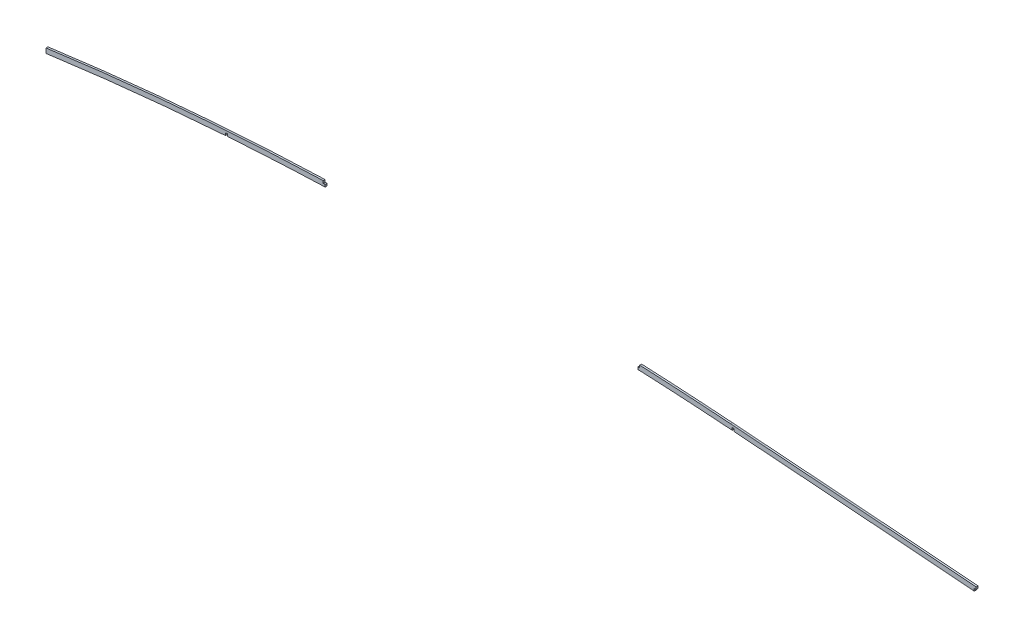
ISO-10303-21;
HEADER;
FILE_DESCRIPTION(('STEP AP214'),'2;1');
FILE_NAME('part.step','',(''),(''),'','','');
FILE_SCHEMA(('AUTOMOTIVE_DESIGN { 1 0 10303 214 1 1 1 1 }'));
ENDSEC;
DATA;
#1=APPLICATION_CONTEXT('core data for automotive mechanical design processes');
#2=APPLICATION_PROTOCOL_DEFINITION('international standard','automotive_design',2000,#1);
#3=PRODUCT_CONTEXT('',#1,'mechanical');
#4=PRODUCT('Part','Part','',(#3));
#5=PRODUCT_RELATED_PRODUCT_CATEGORY('part','',(#4));
#6=PRODUCT_DEFINITION_FORMATION('','',#4);
#7=PRODUCT_DEFINITION_CONTEXT('part definition',#1,'design');
#8=PRODUCT_DEFINITION('design','',#6,#7);
#9=PRODUCT_DEFINITION_SHAPE('','',#8);
#10=(LENGTH_UNIT() NAMED_UNIT(*) SI_UNIT(.MILLI.,.METRE.));
#11=(NAMED_UNIT(*) PLANE_ANGLE_UNIT() SI_UNIT($,.RADIAN.));
#12=(NAMED_UNIT(*) SI_UNIT($,.STERADIAN.) SOLID_ANGLE_UNIT());
#13=UNCERTAINTY_MEASURE_WITH_UNIT(LENGTH_MEASURE(1.E-05),#10,'distance_accuracy_value','');
#14=(GEOMETRIC_REPRESENTATION_CONTEXT(3) GLOBAL_UNCERTAINTY_ASSIGNED_CONTEXT((#13)) GLOBAL_UNIT_ASSIGNED_CONTEXT((#10,
#11,#12)) REPRESENTATION_CONTEXT('',''));
#15=CARTESIAN_POINT('',(0.,0.,0.));
#16=DIRECTION('',(0.,0.,1.));
#17=DIRECTION('',(1.,0.,0.));
#18=AXIS2_PLACEMENT_3D('',#15,#16,#17);
#19=CARTESIAN_POINT('',(-57.6775547463184,-16620.4625365052,10.));
#20=DIRECTION('',(0.,0.,-1.));
#21=DIRECTION('',(-1.,0.,0.));
#22=AXIS2_PLACEMENT_3D('',#19,#20,#21);
#23=CYLINDRICAL_SURFACE('',#22,16978.1833333334);
#24=CARTESIAN_POINT('',(-57.6775547463184,-16620.4625365052,0.));
#25=DIRECTION('',(0.,0.,1.));
#26=DIRECTION('',(1.,0.,0.));
#27=AXIS2_PLACEMENT_3D('',#24,#25,#26);
#28=CIRCLE('',#27,16978.1833333334);
#29=CARTESIAN_POINT('',(1179.43012077339,312.59016817414,0.));
#30=VERTEX_POINT('',#29);
#31=CARTESIAN_POINT('',(701.251734504425,340.750144955326,0.));
#32=VERTEX_POINT('',#31);
#33=EDGE_CURVE('E195',#30,#32,#28,.T.);
#34=ORIENTED_EDGE('',*,*,#33,.F.);
#35=DIRECTION('',(0.,0.,-1.));
#36=VECTOR('',#35,1.);
#37=CARTESIAN_POINT('',(1179.43012077339,312.59016817414,10.));
#38=LINE('',#37,#36);
#39=CARTESIAN_POINT('',(1179.43012077339,312.59016817414,10.));
#40=VERTEX_POINT('',#39);
#41=EDGE_CURVE('E12',#40,#30,#38,.T.);
#42=ORIENTED_EDGE('',*,*,#41,.F.);
#43=CARTESIAN_POINT('',(-57.6775547463184,-16620.4625365052,10.));
#44=DIRECTION('',(0.,0.,1.));
#45=DIRECTION('',(1.,0.,0.));
#46=AXIS2_PLACEMENT_3D('',#43,#44,#45);
#47=CIRCLE('',#46,16978.1833333334);
#48=CARTESIAN_POINT('',(701.251734504425,340.750144955326,10.));
#49=VERTEX_POINT('',#48);
#50=EDGE_CURVE('E249',#40,#49,#47,.T.);
#51=ORIENTED_EDGE('',*,*,#50,.T.);
#52=DIRECTION('',(0.,0.,-1.));
#53=VECTOR('',#52,1.);
#54=CARTESIAN_POINT('',(701.251734504425,340.750144955326,10.));
#55=LINE('',#54,#53);
#56=EDGE_CURVE('E72',#49,#32,#55,.T.);
#57=ORIENTED_EDGE('',*,*,#56,.T.);
#58=EDGE_LOOP('',(#34,#42,#51,#57));
#59=FACE_BOUND('',#58,.T.);
#60=ADVANCED_FACE('F55',(#59),#23,.F.);
#61=CARTESIAN_POINT('',(-18336.3104920485,-266811.340033728,10.));
#62=DIRECTION('',(0.,0.,-1.));
#63=DIRECTION('',(-1.,0.,0.));
#64=AXIS2_PLACEMENT_3D('',#61,#62,#63);
#65=CYLINDRICAL_SURFACE('',#64,267835.879258507);
#66=CARTESIAN_POINT('',(-18336.3104920485,-266811.340033728,0.));
#67=DIRECTION('',(0.,0.,1.));
#68=DIRECTION('',(1.,0.,0.));
#69=AXIS2_PLACEMENT_3D('',#66,#67,#68);
#70=CIRCLE('',#69,267835.879258507);
#71=CARTESIAN_POINT('',(1191.25012077462,311.72635083213,0.));
#72=VERTEX_POINT('',#71);
#73=EDGE_CURVE('E198',#30,#72,#70,.F.);
#74=ORIENTED_EDGE('',*,*,#73,.T.);
#75=DIRECTION('',(0.,0.,-1.));
#76=VECTOR('',#75,1.);
#77=CARTESIAN_POINT('',(1191.25012077462,311.72635083213,10.));
#78=LINE('',#77,#76);
#79=CARTESIAN_POINT('',(1191.25012077462,311.72635083213,10.));
#80=VERTEX_POINT('',#79);
#81=EDGE_CURVE('E64',#80,#72,#78,.T.);
#82=ORIENTED_EDGE('',*,*,#81,.F.);
#83=CARTESIAN_POINT('',(-18336.3104920485,-266811.340033728,10.));
#84=DIRECTION('',(0.,0.,1.));
#85=DIRECTION('',(1.,0.,0.));
#86=AXIS2_PLACEMENT_3D('',#83,#84,#85);
#87=CIRCLE('',#86,267835.879258507);
#88=EDGE_CURVE('E549',#40,#80,#87,.F.);
#89=ORIENTED_EDGE('',*,*,#88,.F.);
#90=ORIENTED_EDGE('',*,*,#41,.T.);
#91=EDGE_LOOP('',(#74,#82,#89,#90));
#92=FACE_BOUND('',#91,.T.);
#93=ADVANCED_FACE('F294',(#92),#65,.F.);
#94=CARTESIAN_POINT('',(1191.25012077462,0.,10.));
#95=DIRECTION('',(1.,0.,0.));
#96=DIRECTION('',(0.,0.,-1.));
#97=AXIS2_PLACEMENT_3D('',#94,#95,#96);
#98=PLANE('',#97);
#99=DIRECTION('',(0.,-1.,0.));
#100=VECTOR('',#99,1.);
#101=CARTESIAN_POINT('',(1191.25012077462,0.,0.));
#102=LINE('',#101,#100);
#103=CARTESIAN_POINT('',(1191.25012077462,324.22635083213,0.));
#104=VERTEX_POINT('',#103);
#105=EDGE_CURVE('E202',#104,#72,#102,.T.);
#106=ORIENTED_EDGE('',*,*,#105,.F.);
#107=DIRECTION('',(0.,0.,-1.));
#108=VECTOR('',#107,1.);
#109=CARTESIAN_POINT('',(1191.25012077462,324.22635083213,10.));
#110=LINE('',#109,#108);
#111=CARTESIAN_POINT('',(1191.25012077462,324.22635083213,10.));
#112=VERTEX_POINT('',#111);
#113=EDGE_CURVE('E282',#112,#104,#110,.T.);
#114=ORIENTED_EDGE('',*,*,#113,.F.);
#115=DIRECTION('',(0.,-1.,0.));
#116=VECTOR('',#115,1.);
#117=CARTESIAN_POINT('',(1191.25012077462,0.,10.));
#118=LINE('',#117,#116);
#119=EDGE_CURVE('E291',#112,#80,#118,.T.);
#120=ORIENTED_EDGE('',*,*,#119,.T.);
#121=ORIENTED_EDGE('',*,*,#81,.T.);
#122=EDGE_LOOP('',(#106,#114,#120,#121));
#123=FACE_BOUND('',#122,.T.);
#124=ADVANCED_FACE('F289',(#123),#98,.T.);
#125=CARTESIAN_POINT('',(0.,324.22635083213,10.));
#126=DIRECTION('',(0.,1.,0.));
#127=DIRECTION('',(0.,0.,1.));
#128=AXIS2_PLACEMENT_3D('',#125,#126,#127);
#129=PLANE('',#128);
#130=DIRECTION('',(1.,0.,0.));
#131=VECTOR('',#130,1.);
#132=CARTESIAN_POINT('',(0.,324.22635083213,0.));
#133=LINE('',#132,#131);
#134=CARTESIAN_POINT('',(1201.25012077462,324.22635083213,0.));
#135=VERTEX_POINT('',#134);
#136=EDGE_CURVE('E206',#104,#135,#133,.T.);
#137=ORIENTED_EDGE('',*,*,#136,.T.);
#138=DIRECTION('',(0.,0.,-1.));
#139=VECTOR('',#138,1.);
#140=CARTESIAN_POINT('',(1201.25012077462,324.22635083213,10.));
#141=LINE('',#140,#139);
#142=CARTESIAN_POINT('',(1201.25012077462,324.22635083213,10.));
#143=VERTEX_POINT('',#142);
#144=EDGE_CURVE('E278',#143,#135,#141,.T.);
#145=ORIENTED_EDGE('',*,*,#144,.F.);
#146=DIRECTION('',(1.,0.,0.));
#147=VECTOR('',#146,1.);
#148=CARTESIAN_POINT('',(0.,324.22635083213,10.));
#149=LINE('',#148,#147);
#150=EDGE_CURVE('E312',#112,#143,#149,.T.);
#151=ORIENTED_EDGE('',*,*,#150,.F.);
#152=ORIENTED_EDGE('',*,*,#113,.T.);
#153=EDGE_LOOP('',(#137,#145,#151,#152));
#154=FACE_BOUND('',#153,.T.);
#155=ADVANCED_FACE('F302',(#154),#129,.F.);
#156=CARTESIAN_POINT('',(1201.25012077462,0.,10.));
#157=DIRECTION('',(1.,0.,0.));
#158=DIRECTION('',(0.,0.,-1.));
#159=AXIS2_PLACEMENT_3D('',#156,#157,#158);
#160=PLANE('',#159);
#161=DIRECTION('',(0.,-1.,0.));
#162=VECTOR('',#161,1.);
#163=CARTESIAN_POINT('',(1201.25012077462,0.,0.));
#164=LINE('',#163,#162);
#165=CARTESIAN_POINT('',(1201.25012077462,310.995130289885,0.));
#166=VERTEX_POINT('',#165);
#167=EDGE_CURVE('E209',#135,#166,#164,.T.);
#168=ORIENTED_EDGE('',*,*,#167,.T.);
#169=DIRECTION('',(0.,0.,-1.));
#170=VECTOR('',#169,1.);
#171=CARTESIAN_POINT('',(1201.25012077462,310.995130289885,10.));
#172=LINE('',#171,#170);
#173=CARTESIAN_POINT('',(1201.25012077462,310.995130289885,10.));
#174=VERTEX_POINT('',#173);
#175=EDGE_CURVE('E274',#174,#166,#172,.T.);
#176=ORIENTED_EDGE('',*,*,#175,.F.);
#177=DIRECTION('',(0.,-1.,0.));
#178=VECTOR('',#177,1.);
#179=CARTESIAN_POINT('',(1201.25012077462,0.,10.));
#180=LINE('',#179,#178);
#181=EDGE_CURVE('E308',#143,#174,#180,.T.);
#182=ORIENTED_EDGE('',*,*,#181,.F.);
#183=ORIENTED_EDGE('',*,*,#144,.T.);
#184=EDGE_LOOP('',(#168,#176,#182,#183));
#185=FACE_BOUND('',#184,.T.);
#186=ADVANCED_FACE('F306',(#185),#160,.F.);
#187=CARTESIAN_POINT('',(-18336.3104920485,-266811.340033728,10.));
#188=DIRECTION('',(0.,0.,-1.));
#189=DIRECTION('',(-1.,0.,0.));
#190=AXIS2_PLACEMENT_3D('',#187,#188,#189);
#191=CYLINDRICAL_SURFACE('',#190,267835.879258507);
#192=CARTESIAN_POINT('',(-18336.3104920485,-266811.340033728,0.));
#193=DIRECTION('',(0.,0.,1.));
#194=DIRECTION('',(1.,0.,0.));
#195=AXIS2_PLACEMENT_3D('',#192,#193,#194);
#196=CIRCLE('',#195,267835.879258507);
#197=CARTESIAN_POINT('',(2473.07752210407,214.927566772419,0.));
#198=VERTEX_POINT('',#197);
#199=EDGE_CURVE('E212',#166,#198,#196,.F.);
#200=ORIENTED_EDGE('',*,*,#199,.T.);
#201=DIRECTION('',(0.,0.,-1.));
#202=VECTOR('',#201,1.);
#203=CARTESIAN_POINT('',(2473.07752210407,214.927566772419,10.));
#204=LINE('',#203,#202);
#205=CARTESIAN_POINT('',(2473.07752210407,214.927566772419,10.));
#206=VERTEX_POINT('',#205);
#207=EDGE_CURVE('E271',#206,#198,#204,.T.);
#208=ORIENTED_EDGE('',*,*,#207,.F.);
#209=CARTESIAN_POINT('',(-18336.3104920485,-266811.340033728,10.));
#210=DIRECTION('',(0.,0.,1.));
#211=DIRECTION('',(1.,0.,0.));
#212=AXIS2_PLACEMENT_3D('',#209,#210,#211);
#213=CIRCLE('',#212,267835.879258507);
#214=EDGE_CURVE('E311',#174,#206,#213,.F.);
#215=ORIENTED_EDGE('',*,*,#214,.F.);
#216=ORIENTED_EDGE('',*,*,#175,.T.);
#217=EDGE_LOOP('',(#200,#208,#215,#216));
#218=FACE_BOUND('',#217,.T.);
#219=ADVANCED_FACE('F367',(#218),#191,.F.);
#220=CARTESIAN_POINT('',(2473.07752210408,9.34024214418523E-11,10.));
#221=DIRECTION('',(1.,0.,0.));
#222=DIRECTION('',(0.,1.,0.));
#223=AXIS2_PLACEMENT_3D('',#220,#221,#222);
#224=PLANE('',#223);
#225=DIRECTION('',(0.,-1.,0.));
#226=VECTOR('',#225,1.);
#227=CARTESIAN_POINT('',(2473.07752210408,9.34024214418523E-11,0.));
#228=LINE('',#227,#226);
#229=CARTESIAN_POINT('',(2473.07752210407,226.686009709286,0.));
#230=VERTEX_POINT('',#229);
#231=EDGE_CURVE('E216',#230,#198,#228,.T.);
#232=ORIENTED_EDGE('',*,*,#231,.F.);
#233=DIRECTION('',(0.,0.,-1.));
#234=VECTOR('',#233,1.);
#235=CARTESIAN_POINT('',(2473.07752210407,226.686009709286,10.));
#236=LINE('',#235,#234);
#237=CARTESIAN_POINT('',(2473.07752210407,226.686009709286,10.));
#238=VERTEX_POINT('',#237);
#239=EDGE_CURVE('E268',#238,#230,#236,.T.);
#240=ORIENTED_EDGE('',*,*,#239,.F.);
#241=DIRECTION('',(0.,-1.,0.));
#242=VECTOR('',#241,1.);
#243=CARTESIAN_POINT('',(2473.07752210408,9.34024214418523E-11,10.));
#244=LINE('',#243,#242);
#245=EDGE_CURVE('E316',#238,#206,#244,.T.);
#246=ORIENTED_EDGE('',*,*,#245,.T.);
#247=ORIENTED_EDGE('',*,*,#207,.T.);
#248=EDGE_LOOP('',(#232,#240,#246,#247));
#249=FACE_BOUND('',#248,.T.);
#250=ADVANCED_FACE('F370',(#249),#224,.T.);
#251=CARTESIAN_POINT('',(0.,226.686009709286,10.));
#252=DIRECTION('',(0.,-1.,0.));
#253=DIRECTION('',(0.,0.,-1.));
#254=AXIS2_PLACEMENT_3D('',#251,#252,#253);
#255=PLANE('',#254);
#256=DIRECTION('',(-1.,0.,0.));
#257=VECTOR('',#256,1.);
#258=CARTESIAN_POINT('',(0.,226.686009709286,0.));
#259=LINE('',#258,#257);
#260=CARTESIAN_POINT('',(2483.07752210407,226.686009709286,0.));
#261=VERTEX_POINT('',#260);
#262=EDGE_CURVE('E220',#261,#230,#259,.T.);
#263=ORIENTED_EDGE('',*,*,#262,.F.);
#264=DIRECTION('',(0.,0.,-1.));
#265=VECTOR('',#264,1.);
#266=CARTESIAN_POINT('',(2483.07752210407,226.686009709286,10.));
#267=LINE('',#266,#265);
#268=CARTESIAN_POINT('',(2483.07752210407,226.686009709286,10.));
#269=VERTEX_POINT('',#268);
#270=EDGE_CURVE('E265',#269,#261,#267,.T.);
#271=ORIENTED_EDGE('',*,*,#270,.F.);
#272=DIRECTION('',(-1.,0.,0.));
#273=VECTOR('',#272,1.);
#274=CARTESIAN_POINT('',(0.,226.686009709286,10.));
#275=LINE('',#274,#273);
#276=EDGE_CURVE('E324',#269,#238,#275,.T.);
#277=ORIENTED_EDGE('',*,*,#276,.T.);
#278=ORIENTED_EDGE('',*,*,#239,.T.);
#279=EDGE_LOOP('',(#263,#271,#277,#278));
#280=FACE_BOUND('',#279,.T.);
#281=ADVANCED_FACE('F374',(#280),#255,.T.);
#282=CARTESIAN_POINT('',(2483.07752210407,0.,10.));
#283=DIRECTION('',(1.,0.,0.));
#284=DIRECTION('',(0.,0.,-1.));
#285=AXIS2_PLACEMENT_3D('',#282,#283,#284);
#286=PLANE('',#285);
#287=DIRECTION('',(0.,-1.,0.));
#288=VECTOR('',#287,1.);
#289=CARTESIAN_POINT('',(2483.07752210407,0.,0.));
#290=LINE('',#289,#288);
#291=CARTESIAN_POINT('',(2483.07752210407,239.223942191532,0.));
#292=VERTEX_POINT('',#291);
#293=EDGE_CURVE('E224',#292,#261,#290,.T.);
#294=ORIENTED_EDGE('',*,*,#293,.F.);
#295=DIRECTION('',(0.,0.,-1.));
#296=VECTOR('',#295,1.);
#297=CARTESIAN_POINT('',(2483.07752210407,239.223942191532,10.));
#298=LINE('',#297,#296);
#299=CARTESIAN_POINT('',(2483.07752210407,239.223942191532,10.));
#300=VERTEX_POINT('',#299);
#301=EDGE_CURVE('E262',#300,#292,#298,.T.);
#302=ORIENTED_EDGE('',*,*,#301,.F.);
#303=DIRECTION('',(0.,-1.,0.));
#304=VECTOR('',#303,1.);
#305=CARTESIAN_POINT('',(2483.07752210407,0.,10.));
#306=LINE('',#305,#304);
#307=EDGE_CURVE('E328',#300,#269,#306,.T.);
#308=ORIENTED_EDGE('',*,*,#307,.T.);
#309=ORIENTED_EDGE('',*,*,#270,.T.);
#310=EDGE_LOOP('',(#294,#302,#308,#309));
#311=FACE_BOUND('',#310,.T.);
#312=ADVANCED_FACE('F378',(#311),#286,.T.);
#313=CARTESIAN_POINT('',(-18336.3104920485,-266811.340033728,10.));
#314=DIRECTION('',(0.,0.,-1.));
#315=DIRECTION('',(-1.,0.,0.));
#316=AXIS2_PLACEMENT_3D('',#313,#314,#315);
#317=CYLINDRICAL_SURFACE('',#316,267860.879258507);
#318=CARTESIAN_POINT('',(-18336.3104920485,-266811.340033728,0.));
#319=DIRECTION('',(0.,0.,1.));
#320=DIRECTION('',(1.,0.,0.));
#321=AXIS2_PLACEMENT_3D('',#318,#319,#320);
#322=CIRCLE('',#321,267860.879258507);
#323=CARTESIAN_POINT('',(1181.25173450441,337.523714320128,0.));
#324=VERTEX_POINT('',#323);
#325=EDGE_CURVE('E228',#324,#292,#322,.F.);
#326=ORIENTED_EDGE('',*,*,#325,.F.);
#327=DIRECTION('',(0.,0.,-1.));
#328=VECTOR('',#327,1.);
#329=CARTESIAN_POINT('',(1181.25173450441,337.523714320128,10.));
#330=LINE('',#329,#328);
#331=CARTESIAN_POINT('',(1181.25173450441,337.523714320128,10.));
#332=VERTEX_POINT('',#331);
#333=EDGE_CURVE('E259',#332,#324,#330,.T.);
#334=ORIENTED_EDGE('',*,*,#333,.F.);
#335=CARTESIAN_POINT('',(-18336.3104920485,-266811.340033728,10.));
#336=DIRECTION('',(0.,0.,1.));
#337=DIRECTION('',(1.,0.,0.));
#338=AXIS2_PLACEMENT_3D('',#335,#336,#337);
#339=CIRCLE('',#338,267860.879258507);
#340=EDGE_CURVE('E332',#332,#300,#339,.F.);
#341=ORIENTED_EDGE('',*,*,#340,.T.);
#342=ORIENTED_EDGE('',*,*,#301,.T.);
#343=EDGE_LOOP('',(#326,#334,#341,#342));
#344=FACE_BOUND('',#343,.T.);
#345=ADVANCED_FACE('F382',(#344),#317,.T.);
#346=CARTESIAN_POINT('',(-57.6775547463184,-16620.4625365052,10.));
#347=DIRECTION('',(0.,0.,-1.));
#348=DIRECTION('',(-1.,0.,0.));
#349=AXIS2_PLACEMENT_3D('',#346,#347,#348);
#350=CYLINDRICAL_SURFACE('',#349,17003.1833333334);
#351=CARTESIAN_POINT('',(-57.6775547463184,-16620.4625365052,0.));
#352=DIRECTION('',(0.,0.,1.));
#353=DIRECTION('',(1.,0.,0.));
#354=AXIS2_PLACEMENT_3D('',#351,#352,#353);
#355=CIRCLE('',#354,17003.1833333334);
#356=CARTESIAN_POINT('',(701.251734504425,365.775122282297,0.));
#357=VERTEX_POINT('',#356);
#358=EDGE_CURVE('E232',#324,#357,#355,.T.);
#359=ORIENTED_EDGE('',*,*,#358,.T.);
#360=DIRECTION('',(0.,0.,-1.));
#361=VECTOR('',#360,1.);
#362=CARTESIAN_POINT('',(701.251734504425,365.775122282297,10.));
#363=LINE('',#362,#361);
#364=CARTESIAN_POINT('',(701.251734504425,365.775122282297,10.));
#365=VERTEX_POINT('',#364);
#366=EDGE_CURVE('E256',#365,#357,#363,.T.);
#367=ORIENTED_EDGE('',*,*,#366,.F.);
#368=CARTESIAN_POINT('',(-57.6775547463184,-16620.4625365052,10.));
#369=DIRECTION('',(0.,0.,1.));
#370=DIRECTION('',(1.,0.,0.));
#371=AXIS2_PLACEMENT_3D('',#368,#369,#370);
#372=CIRCLE('',#371,17003.1833333334);
#373=EDGE_CURVE('E336',#332,#365,#372,.T.);
#374=ORIENTED_EDGE('',*,*,#373,.F.);
#375=ORIENTED_EDGE('',*,*,#333,.T.);
#376=EDGE_LOOP('',(#359,#367,#374,#375));
#377=FACE_BOUND('',#376,.T.);
#378=ADVANCED_FACE('F386',(#377),#350,.T.);
#379=CARTESIAN_POINT('',(701.251734504415,-1.8647837869421E-11,10.));
#380=DIRECTION('',(-1.,0.,0.));
#381=DIRECTION('',(0.,-1.,0.));
#382=AXIS2_PLACEMENT_3D('',#379,#380,#381);
#383=PLANE('',#382);
#384=DIRECTION('',(0.,1.,0.));
#385=VECTOR('',#384,1.);
#386=CARTESIAN_POINT('',(701.251734504415,-1.8647837869421E-11,0.));
#387=LINE('',#386,#385);
#388=CARTESIAN_POINT('',(701.251734504425,353.250144955326,0.));
#389=VERTEX_POINT('',#388);
#390=EDGE_CURVE('E236',#389,#357,#387,.T.);
#391=ORIENTED_EDGE('',*,*,#390,.F.);
#392=DIRECTION('',(0.,0.,-1.));
#393=VECTOR('',#392,1.);
#394=CARTESIAN_POINT('',(701.251734504425,353.250144955326,10.));
#395=LINE('',#394,#393);
#396=CARTESIAN_POINT('',(701.251734504425,353.250144955326,10.));
#397=VERTEX_POINT('',#396);
#398=EDGE_CURVE('E174',#397,#389,#395,.T.);
#399=ORIENTED_EDGE('',*,*,#398,.F.);
#400=DIRECTION('',(0.,1.,0.));
#401=VECTOR('',#400,1.);
#402=CARTESIAN_POINT('',(701.251734504415,-1.8647837869421E-11,10.));
#403=LINE('',#402,#401);
#404=EDGE_CURVE('E184',#397,#365,#403,.T.);
#405=ORIENTED_EDGE('',*,*,#404,.T.);
#406=ORIENTED_EDGE('',*,*,#366,.T.);
#407=EDGE_LOOP('',(#391,#399,#405,#406));
#408=FACE_BOUND('',#407,.T.);
#409=ADVANCED_FACE('F341',(#408),#383,.T.);
#410=CARTESIAN_POINT('',(0.,353.250144955326,10.));
#411=DIRECTION('',(0.,1.,0.));
#412=DIRECTION('',(0.,0.,1.));
#413=AXIS2_PLACEMENT_3D('',#410,#411,#412);
#414=PLANE('',#413);
#415=DIRECTION('',(1.,0.,0.));
#416=VECTOR('',#415,1.);
#417=CARTESIAN_POINT('',(0.,353.250144955326,0.));
#418=LINE('',#417,#416);
#419=CARTESIAN_POINT('',(691.251734504425,353.250144955326,0.));
#420=VERTEX_POINT('',#419);
#421=EDGE_CURVE('E169',#420,#389,#418,.T.);
#422=ORIENTED_EDGE('',*,*,#421,.F.);
#423=DIRECTION('',(0.,0.,-1.));
#424=VECTOR('',#423,1.);
#425=CARTESIAN_POINT('',(691.251734504425,353.250144955326,10.));
#426=LINE('',#425,#424);
#427=CARTESIAN_POINT('',(691.251734504425,353.250144955326,10.));
#428=VERTEX_POINT('',#427);
#429=EDGE_CURVE('E164',#428,#420,#426,.T.);
#430=ORIENTED_EDGE('',*,*,#429,.F.);
#431=DIRECTION('',(1.,0.,0.));
#432=VECTOR('',#431,1.);
#433=CARTESIAN_POINT('',(0.,353.250144955326,10.));
#434=LINE('',#433,#432);
#435=EDGE_CURVE('E167',#428,#397,#434,.T.);
#436=ORIENTED_EDGE('',*,*,#435,.T.);
#437=ORIENTED_EDGE('',*,*,#398,.T.);
#438=EDGE_LOOP('',(#422,#430,#436,#437));
#439=FACE_BOUND('',#438,.T.);
#440=ADVANCED_FACE('F166',(#439),#414,.T.);
#441=CARTESIAN_POINT('',(691.251734504425,0.,10.));
#442=DIRECTION('',(-1.,0.,0.));
#443=DIRECTION('',(0.,0.,1.));
#444=AXIS2_PLACEMENT_3D('',#441,#442,#443);
#445=PLANE('',#444);
#446=DIRECTION('',(0.,1.,0.));
#447=VECTOR('',#446,1.);
#448=CARTESIAN_POINT('',(691.251734504425,0.,0.));
#449=LINE('',#448,#447);
#450=CARTESIAN_POINT('',(691.251734504425,340.750144955326,0.));
#451=VERTEX_POINT('',#450);
#452=EDGE_CURVE('E242',#451,#420,#449,.T.);
#453=ORIENTED_EDGE('',*,*,#452,.F.);
#454=DIRECTION('',(0.,0.,-1.));
#455=VECTOR('',#454,1.);
#456=CARTESIAN_POINT('',(691.251734504425,340.750144955326,10.));
#457=LINE('',#456,#455);
#458=CARTESIAN_POINT('',(691.251734504425,340.750144955326,10.));
#459=VERTEX_POINT('',#458);
#460=EDGE_CURVE('E118',#459,#451,#457,.T.);
#461=ORIENTED_EDGE('',*,*,#460,.F.);
#462=DIRECTION('',(0.,1.,0.));
#463=VECTOR('',#462,1.);
#464=CARTESIAN_POINT('',(691.251734504425,0.,10.));
#465=LINE('',#464,#463);
#466=EDGE_CURVE('E182',#459,#428,#465,.T.);
#467=ORIENTED_EDGE('',*,*,#466,.T.);
#468=ORIENTED_EDGE('',*,*,#429,.T.);
#469=EDGE_LOOP('',(#453,#461,#467,#468));
#470=FACE_BOUND('',#469,.T.);
#471=ADVANCED_FACE('F187',(#470),#445,.T.);
#472=CARTESIAN_POINT('',(0.,340.750144955326,10.));
#473=DIRECTION('',(0.,-1.,0.));
#474=DIRECTION('',(0.,0.,-1.));
#475=AXIS2_PLACEMENT_3D('',#472,#473,#474);
#476=PLANE('',#475);
#477=DIRECTION('',(-1.,0.,0.));
#478=VECTOR('',#477,1.);
#479=CARTESIAN_POINT('',(0.,340.750144955326,0.));
#480=LINE('',#479,#478);
#481=EDGE_CURVE('E245',#32,#451,#480,.T.);
#482=ORIENTED_EDGE('',*,*,#481,.F.);
#483=ORIENTED_EDGE('',*,*,#56,.F.);
#484=DIRECTION('',(-1.,0.,0.));
#485=VECTOR('',#484,1.);
#486=CARTESIAN_POINT('',(0.,340.750144955326,10.));
#487=LINE('',#486,#485);
#488=EDGE_CURVE('E189',#49,#459,#487,.T.);
#489=ORIENTED_EDGE('',*,*,#488,.T.);
#490=ORIENTED_EDGE('',*,*,#460,.T.);
#491=EDGE_LOOP('',(#482,#483,#489,#490));
#492=FACE_BOUND('',#491,.T.);
#493=ADVANCED_FACE('F344',(#492),#476,.T.);
#494=CARTESIAN_POINT('',(0.,0.,10.));
#495=DIRECTION('',(0.,0.,1.));
#496=DIRECTION('',(1.,0.,0.));
#497=AXIS2_PLACEMENT_3D('',#494,#495,#496);
#498=PLANE('',#497);
#499=ORIENTED_EDGE('',*,*,#50,.F.);
#500=ORIENTED_EDGE('',*,*,#88,.T.);
#501=ORIENTED_EDGE('',*,*,#119,.F.);
#502=ORIENTED_EDGE('',*,*,#150,.T.);
#503=ORIENTED_EDGE('',*,*,#181,.T.);
#504=ORIENTED_EDGE('',*,*,#214,.T.);
#505=ORIENTED_EDGE('',*,*,#245,.F.);
#506=ORIENTED_EDGE('',*,*,#276,.F.);
#507=ORIENTED_EDGE('',*,*,#307,.F.);
#508=ORIENTED_EDGE('',*,*,#340,.F.);
#509=ORIENTED_EDGE('',*,*,#373,.T.);
#510=ORIENTED_EDGE('',*,*,#404,.F.);
#511=ORIENTED_EDGE('',*,*,#435,.F.);
#512=ORIENTED_EDGE('',*,*,#466,.F.);
#513=ORIENTED_EDGE('',*,*,#488,.F.);
#514=EDGE_LOOP('',(#499,#500,#501,#502,#503,#504,#505,#506,#507,#508,#509,#510,#511,#512,#513));
#515=FACE_BOUND('',#514,.T.);
#516=ADVANCED_FACE('F180',(#515),#498,.T.);
#517=CARTESIAN_POINT('',(0.,0.,0.));
#518=DIRECTION('',(0.,0.,1.));
#519=DIRECTION('',(1.,0.,0.));
#520=AXIS2_PLACEMENT_3D('',#517,#518,#519);
#521=PLANE('',#520);
#522=ORIENTED_EDGE('',*,*,#33,.T.);
#523=ORIENTED_EDGE('',*,*,#481,.T.);
#524=ORIENTED_EDGE('',*,*,#452,.T.);
#525=ORIENTED_EDGE('',*,*,#421,.T.);
#526=ORIENTED_EDGE('',*,*,#390,.T.);
#527=ORIENTED_EDGE('',*,*,#358,.F.);
#528=ORIENTED_EDGE('',*,*,#325,.T.);
#529=ORIENTED_EDGE('',*,*,#293,.T.);
#530=ORIENTED_EDGE('',*,*,#262,.T.);
#531=ORIENTED_EDGE('',*,*,#231,.T.);
#532=ORIENTED_EDGE('',*,*,#199,.F.);
#533=ORIENTED_EDGE('',*,*,#167,.F.);
#534=ORIENTED_EDGE('',*,*,#136,.F.);
#535=ORIENTED_EDGE('',*,*,#105,.T.);
#536=ORIENTED_EDGE('',*,*,#73,.F.);
#537=EDGE_LOOP('',(#522,#523,#524,#525,#526,#527,#528,#529,#530,#531,#532,#533,#534,#535,#536));
#538=FACE_BOUND('',#537,.T.);
#539=ADVANCED_FACE('F297',(#538),#521,.F.);
#540=CLOSED_SHELL('',(#60,#93,#124,#155,#186,#219,#250,#281,#312,#345,#378,#409,#440,#471,#493,
#516,#539));
#541=MANIFOLD_SOLID_BREP('B2',#540);
#542=CARTESIAN_POINT('',(-475.006665925802,-14123.3280251563,10.));
#543=DIRECTION('',(0.,0.,-1.));
#544=DIRECTION('',(-1.,0.,0.));
#545=AXIS2_PLACEMENT_3D('',#542,#543,#544);
#546=CYLINDRICAL_SURFACE('',#545,14481.0488219718);
#547=CARTESIAN_POINT('',(-475.006665925802,-14123.3280251563,0.));
#548=DIRECTION('',(0.,0.,1.));
#549=DIRECTION('',(1.,0.,0.));
#550=AXIS2_PLACEMENT_3D('',#547,#548,#549);
#551=CIRCLE('',#550,14481.0488219718);
#552=CARTESIAN_POINT('',(-975.006665925803,349.086251125701,0.));
#553=VERTEX_POINT('',#552);
#554=CARTESIAN_POINT('',(-1482.3466659258,322.641693375271,0.));
#555=VERTEX_POINT('',#554);
#556=EDGE_CURVE('E669',#553,#555,#551,.T.);
#557=ORIENTED_EDGE('',*,*,#556,.F.);
#558=DIRECTION('',(0.,0.,-1.));
#559=VECTOR('',#558,1.);
#560=CARTESIAN_POINT('',(-975.006665925803,349.086251125701,10.));
#561=LINE('',#560,#559);
#562=CARTESIAN_POINT('',(-975.006665925803,349.086251125701,10.));
#563=VERTEX_POINT('',#562);
#564=EDGE_CURVE('E53',#563,#553,#561,.T.);
#565=ORIENTED_EDGE('',*,*,#564,.F.);
#566=CARTESIAN_POINT('',(-475.006665925802,-14123.3280251563,10.));
#567=DIRECTION('',(0.,0.,1.));
#568=DIRECTION('',(1.,0.,0.));
#569=AXIS2_PLACEMENT_3D('',#566,#567,#568);
#570=CIRCLE('',#569,14481.0488219718);
#571=CARTESIAN_POINT('',(-1482.3466659258,322.641693375271,10.));
#572=VERTEX_POINT('',#571);
#573=EDGE_CURVE('E694',#563,#572,#570,.T.);
#574=ORIENTED_EDGE('',*,*,#573,.T.);
#575=DIRECTION('',(0.,0.,-1.));
#576=VECTOR('',#575,1.);
#577=CARTESIAN_POINT('',(-1482.3466659258,322.641693375271,10.));
#578=LINE('',#577,#576);
#579=EDGE_CURVE('E573',#572,#555,#578,.T.);
#580=ORIENTED_EDGE('',*,*,#579,.T.);
#581=EDGE_LOOP('',(#557,#565,#574,#580));
#582=FACE_BOUND('',#581,.T.);
#583=ADVANCED_FACE('F556',(#582),#546,.F.);
#584=CARTESIAN_POINT('',(0.,349.086251125701,10.));
#585=DIRECTION('',(0.,1.,0.));
#586=DIRECTION('',(0.,0.,1.));
#587=AXIS2_PLACEMENT_3D('',#584,#585,#586);
#588=PLANE('',#587);
#589=DIRECTION('',(1.,0.,0.));
#590=VECTOR('',#589,1.);
#591=CARTESIAN_POINT('',(0.,349.086251125701,0.));
#592=LINE('',#591,#590);
#593=CARTESIAN_POINT('',(-965.006665925803,349.086251125701,0.));
#594=VERTEX_POINT('',#593);
#595=EDGE_CURVE('E671',#553,#594,#592,.T.);
#596=ORIENTED_EDGE('',*,*,#595,.T.);
#597=DIRECTION('',(0.,0.,-1.));
#598=VECTOR('',#597,1.);
#599=CARTESIAN_POINT('',(-965.006665925803,349.086251125701,10.));
#600=LINE('',#599,#598);
#601=CARTESIAN_POINT('',(-965.006665925803,349.086251125701,10.));
#602=VERTEX_POINT('',#601);
#603=EDGE_CURVE('E565',#602,#594,#600,.T.);
#604=ORIENTED_EDGE('',*,*,#603,.F.);
#605=DIRECTION('',(1.,0.,0.));
#606=VECTOR('',#605,1.);
#607=CARTESIAN_POINT('',(0.,349.086251125701,10.));
#608=LINE('',#607,#606);
#609=EDGE_CURVE('E734',#563,#602,#608,.T.);
#610=ORIENTED_EDGE('',*,*,#609,.F.);
#611=ORIENTED_EDGE('',*,*,#564,.T.);
#612=EDGE_LOOP('',(#596,#604,#610,#611));
#613=FACE_BOUND('',#612,.T.);
#614=ADVANCED_FACE('F558',(#613),#588,.F.);
#615=CARTESIAN_POINT('',(-965.006665925803,0.,10.));
#616=DIRECTION('',(-1.,0.,0.));
#617=DIRECTION('',(0.,0.,1.));
#618=AXIS2_PLACEMENT_3D('',#615,#616,#617);
#619=PLANE('',#618);
#620=DIRECTION('',(0.,1.,0.));
#621=VECTOR('',#620,1.);
#622=CARTESIAN_POINT('',(-965.006665925803,0.,0.));
#623=LINE('',#622,#621);
#624=CARTESIAN_POINT('',(-965.006665925803,361.586251125701,0.));
#625=VERTEX_POINT('',#624);
#626=EDGE_CURVE('E674',#594,#625,#623,.T.);
#627=ORIENTED_EDGE('',*,*,#626,.T.);
#628=DIRECTION('',(0.,0.,-1.));
#629=VECTOR('',#628,1.);
#630=CARTESIAN_POINT('',(-965.006665925803,361.586251125701,10.));
#631=LINE('',#630,#629);
#632=CARTESIAN_POINT('',(-965.006665925803,361.586251125701,10.));
#633=VERTEX_POINT('',#632);
#634=EDGE_CURVE('E706',#633,#625,#631,.T.);
#635=ORIENTED_EDGE('',*,*,#634,.F.);
#636=DIRECTION('',(0.,1.,0.));
#637=VECTOR('',#636,1.);
#638=CARTESIAN_POINT('',(-965.006665925803,0.,10.));
#639=LINE('',#638,#637);
#640=EDGE_CURVE('E715',#602,#633,#639,.T.);
#641=ORIENTED_EDGE('',*,*,#640,.F.);
#642=ORIENTED_EDGE('',*,*,#603,.T.);
#643=EDGE_LOOP('',(#627,#635,#641,#642));
#644=FACE_BOUND('',#643,.T.);
#645=ADVANCED_FACE('F713',(#644),#619,.F.);
#646=CARTESIAN_POINT('',(0.,361.586251125701,10.));
#647=DIRECTION('',(0.,-1.,0.));
#648=DIRECTION('',(0.,0.,-1.));
#649=AXIS2_PLACEMENT_3D('',#646,#647,#648);
#650=PLANE('',#649);
#651=DIRECTION('',(-1.,0.,0.));
#652=VECTOR('',#651,1.);
#653=CARTESIAN_POINT('',(0.,361.586251125701,0.));
#654=LINE('',#653,#652);
#655=CARTESIAN_POINT('',(-975.006665925803,361.586251125701,0.));
#656=VERTEX_POINT('',#655);
#657=EDGE_CURVE('E676',#625,#656,#654,.T.);
#658=ORIENTED_EDGE('',*,*,#657,.T.);
#659=DIRECTION('',(0.,0.,-1.));
#660=VECTOR('',#659,1.);
#661=CARTESIAN_POINT('',(-975.006665925803,361.586251125701,10.));
#662=LINE('',#661,#660);
#663=CARTESIAN_POINT('',(-975.006665925803,361.586251125701,10.));
#664=VERTEX_POINT('',#663);
#665=EDGE_CURVE('E704',#664,#656,#662,.T.);
#666=ORIENTED_EDGE('',*,*,#665,.F.);
#667=DIRECTION('',(-1.,0.,0.));
#668=VECTOR('',#667,1.);
#669=CARTESIAN_POINT('',(0.,361.586251125701,10.));
#670=LINE('',#669,#668);
#671=EDGE_CURVE('E728',#633,#664,#670,.T.);
#672=ORIENTED_EDGE('',*,*,#671,.F.);
#673=ORIENTED_EDGE('',*,*,#634,.T.);
#674=EDGE_LOOP('',(#658,#666,#672,#673));
#675=FACE_BOUND('',#674,.T.);
#676=ADVANCED_FACE('F725',(#675),#650,.F.);
#677=CARTESIAN_POINT('',(-975.006665925803,0.,10.));
#678=DIRECTION('',(1.,0.,0.));
#679=DIRECTION('',(0.,0.,-1.));
#680=AXIS2_PLACEMENT_3D('',#677,#678,#679);
#681=PLANE('',#680);
#682=DIRECTION('',(0.,-1.,0.));
#683=VECTOR('',#682,1.);
#684=CARTESIAN_POINT('',(-975.006665925803,0.,0.));
#685=LINE('',#684,#683);
#686=CARTESIAN_POINT('',(-975.006665925803,374.101140921033,0.));
#687=VERTEX_POINT('',#686);
#688=EDGE_CURVE('E679',#687,#656,#685,.T.);
#689=ORIENTED_EDGE('',*,*,#688,.F.);
#690=DIRECTION('',(0.,0.,-1.));
#691=VECTOR('',#690,1.);
#692=CARTESIAN_POINT('',(-975.006665925803,374.101140921033,10.));
#693=LINE('',#692,#691);
#694=CARTESIAN_POINT('',(-975.006665925803,374.101140921033,10.));
#695=VERTEX_POINT('',#694);
#696=EDGE_CURVE('E702',#695,#687,#693,.T.);
#697=ORIENTED_EDGE('',*,*,#696,.F.);
#698=DIRECTION('',(0.,-1.,0.));
#699=VECTOR('',#698,1.);
#700=CARTESIAN_POINT('',(-975.006665925803,0.,10.));
#701=LINE('',#700,#699);
#702=EDGE_CURVE('E730',#695,#664,#701,.T.);
#703=ORIENTED_EDGE('',*,*,#702,.T.);
#704=ORIENTED_EDGE('',*,*,#665,.T.);
#705=EDGE_LOOP('',(#689,#697,#703,#704));
#706=FACE_BOUND('',#705,.T.);
#707=ADVANCED_FACE('F823',(#706),#681,.T.);
#708=CARTESIAN_POINT('',(-475.006665925802,-14123.3280251563,10.));
#709=DIRECTION('',(0.,0.,-1.));
#710=DIRECTION('',(-1.,0.,0.));
#711=AXIS2_PLACEMENT_3D('',#708,#709,#710);
#712=CYLINDRICAL_SURFACE('',#711,14506.0488219718);
#713=CARTESIAN_POINT('',(-475.006665925802,-14123.3280251563,0.));
#714=DIRECTION('',(0.,0.,1.));
#715=DIRECTION('',(1.,0.,0.));
#716=AXIS2_PLACEMENT_3D('',#713,#714,#715);
#717=CIRCLE('',#716,14506.0488219718);
#718=CARTESIAN_POINT('',(-2443.47234525226,248.540165678982,0.));
#719=VERTEX_POINT('',#718);
#720=EDGE_CURVE('E682',#687,#719,#717,.T.);
#721=ORIENTED_EDGE('',*,*,#720,.T.);
#722=DIRECTION('',(0.,0.,-1.));
#723=VECTOR('',#722,1.);
#724=CARTESIAN_POINT('',(-2443.47234525226,248.540165678982,10.));
#725=LINE('',#724,#723);
#726=CARTESIAN_POINT('',(-2443.47234525226,248.540165678982,10.));
#727=VERTEX_POINT('',#726);
#728=EDGE_CURVE('E700',#727,#719,#725,.T.);
#729=ORIENTED_EDGE('',*,*,#728,.F.);
#730=CARTESIAN_POINT('',(-475.006665925802,-14123.3280251563,10.));
#731=DIRECTION('',(0.,0.,1.));
#732=DIRECTION('',(1.,0.,0.));
#733=AXIS2_PLACEMENT_3D('',#730,#731,#732);
#734=CIRCLE('',#733,14506.0488219718);
#735=EDGE_CURVE('E732',#695,#727,#734,.T.);
#736=ORIENTED_EDGE('',*,*,#735,.F.);
#737=ORIENTED_EDGE('',*,*,#696,.T.);
#738=EDGE_LOOP('',(#721,#729,#736,#737));
#739=FACE_BOUND('',#738,.T.);
#740=ADVANCED_FACE('F760',(#739),#712,.T.);
#741=CARTESIAN_POINT('',(-2443.47234525227,8.6005196819536E-11,10.));
#742=DIRECTION('',(-1.,0.,0.));
#743=DIRECTION('',(0.,-1.,0.));
#744=AXIS2_PLACEMENT_3D('',#741,#742,#743);
#745=PLANE('',#744);
#746=DIRECTION('',(0.,1.,0.));
#747=VECTOR('',#746,1.);
#748=CARTESIAN_POINT('',(-2443.47234525227,8.6005196819536E-11,0.));
#749=LINE('',#748,#747);
#750=CARTESIAN_POINT('',(-2443.47234525226,223.306348579058,0.));
#751=VERTEX_POINT('',#750);
#752=EDGE_CURVE('E685',#751,#719,#749,.T.);
#753=ORIENTED_EDGE('',*,*,#752,.F.);
#754=DIRECTION('',(0.,0.,-1.));
#755=VECTOR('',#754,1.);
#756=CARTESIAN_POINT('',(-2443.47234525226,223.306348579058,10.));
#757=LINE('',#756,#755);
#758=CARTESIAN_POINT('',(-2443.47234525226,223.306348579058,10.));
#759=VERTEX_POINT('',#758);
#760=EDGE_CURVE('E698',#759,#751,#757,.T.);
#761=ORIENTED_EDGE('',*,*,#760,.F.);
#762=DIRECTION('',(0.,1.,0.));
#763=VECTOR('',#762,1.);
#764=CARTESIAN_POINT('',(-2443.47234525227,8.6005196819536E-11,10.));
#765=LINE('',#764,#763);
#766=EDGE_CURVE('E738',#759,#727,#765,.T.);
#767=ORIENTED_EDGE('',*,*,#766,.T.);
#768=ORIENTED_EDGE('',*,*,#728,.T.);
#769=EDGE_LOOP('',(#753,#761,#767,#768));
#770=FACE_BOUND('',#769,.T.);
#771=ADVANCED_FACE('F755',(#770),#745,.T.);
#772=CARTESIAN_POINT('',(-1492.3466659258,321.940899606959,0.));
#773=VERTEX_POINT('',#772);
#774=EDGE_CURVE('E672',#773,#751,#551,.T.);
#775=ORIENTED_EDGE('',*,*,#774,.F.);
#776=DIRECTION('',(0.,0.,-1.));
#777=VECTOR('',#776,1.);
#778=CARTESIAN_POINT('',(-1492.3466659258,321.940899606959,10.));
#779=LINE('',#778,#777);
#780=CARTESIAN_POINT('',(-1492.3466659258,321.940899606959,10.));
#781=VERTEX_POINT('',#780);
#782=EDGE_CURVE('E650',#781,#773,#779,.T.);
#783=ORIENTED_EDGE('',*,*,#782,.F.);
#784=EDGE_CURVE('E661',#781,#759,#570,.T.);
#785=ORIENTED_EDGE('',*,*,#784,.T.);
#786=ORIENTED_EDGE('',*,*,#760,.T.);
#787=EDGE_LOOP('',(#775,#783,#785,#786));
#788=FACE_BOUND('',#787,.T.);
#789=ADVANCED_FACE('F749',(#788),#546,.F.);
#790=CARTESIAN_POINT('',(-1492.3466659258,0.,10.));
#791=DIRECTION('',(1.,0.,0.));
#792=DIRECTION('',(0.,0.,-1.));
#793=AXIS2_PLACEMENT_3D('',#790,#791,#792);
#794=PLANE('',#793);
#795=DIRECTION('',(0.,-1.,0.));
#796=VECTOR('',#795,1.);
#797=CARTESIAN_POINT('',(-1492.3466659258,0.,0.));
#798=LINE('',#797,#796);
#799=CARTESIAN_POINT('',(-1492.3466659258,335.141693375271,0.));
#800=VERTEX_POINT('',#799);
#801=EDGE_CURVE('E646',#800,#773,#798,.T.);
#802=ORIENTED_EDGE('',*,*,#801,.F.);
#803=DIRECTION('',(0.,0.,-1.));
#804=VECTOR('',#803,1.);
#805=CARTESIAN_POINT('',(-1492.3466659258,335.141693375271,10.));
#806=LINE('',#805,#804);
#807=CARTESIAN_POINT('',(-1492.3466659258,335.141693375271,10.));
#808=VERTEX_POINT('',#807);
#809=EDGE_CURVE('E641',#808,#800,#806,.T.);
#810=ORIENTED_EDGE('',*,*,#809,.F.);
#811=DIRECTION('',(0.,-1.,0.));
#812=VECTOR('',#811,1.);
#813=CARTESIAN_POINT('',(-1492.3466659258,0.,10.));
#814=LINE('',#813,#812);
#815=EDGE_CURVE('E644',#808,#781,#814,.T.);
#816=ORIENTED_EDGE('',*,*,#815,.T.);
#817=ORIENTED_EDGE('',*,*,#782,.T.);
#818=EDGE_LOOP('',(#802,#810,#816,#817));
#819=FACE_BOUND('',#818,.T.);
#820=ADVANCED_FACE('F643',(#819),#794,.T.);
#821=CARTESIAN_POINT('',(0.,335.141693375271,10.));
#822=DIRECTION('',(0.,-1.,0.));
#823=DIRECTION('',(0.,0.,-1.));
#824=AXIS2_PLACEMENT_3D('',#821,#822,#823);
#825=PLANE('',#824);
#826=DIRECTION('',(-1.,0.,0.));
#827=VECTOR('',#826,1.);
#828=CARTESIAN_POINT('',(0.,335.141693375271,0.));
#829=LINE('',#828,#827);
#830=CARTESIAN_POINT('',(-1482.3466659258,335.141693375271,0.));
#831=VERTEX_POINT('',#830);
#832=EDGE_CURVE('E689',#831,#800,#829,.T.);
#833=ORIENTED_EDGE('',*,*,#832,.F.);
#834=DIRECTION('',(0.,0.,-1.));
#835=VECTOR('',#834,1.);
#836=CARTESIAN_POINT('',(-1482.3466659258,335.141693375271,10.));
#837=LINE('',#836,#835);
#838=CARTESIAN_POINT('',(-1482.3466659258,335.141693375271,10.));
#839=VERTEX_POINT('',#838);
#840=EDGE_CURVE('E607',#839,#831,#837,.T.);
#841=ORIENTED_EDGE('',*,*,#840,.F.);
#842=DIRECTION('',(-1.,0.,0.));
#843=VECTOR('',#842,1.);
#844=CARTESIAN_POINT('',(0.,335.141693375271,10.));
#845=LINE('',#844,#843);
#846=EDGE_CURVE('E658',#839,#808,#845,.T.);
#847=ORIENTED_EDGE('',*,*,#846,.T.);
#848=ORIENTED_EDGE('',*,*,#809,.T.);
#849=EDGE_LOOP('',(#833,#841,#847,#848));
#850=FACE_BOUND('',#849,.T.);
#851=ADVANCED_FACE('F663',(#850),#825,.T.);
#852=CARTESIAN_POINT('',(-1482.3466659258,0.,10.));
#853=DIRECTION('',(-1.,0.,0.));
#854=DIRECTION('',(0.,0.,1.));
#855=AXIS2_PLACEMENT_3D('',#852,#853,#854);
#856=PLANE('',#855);
#857=DIRECTION('',(0.,1.,0.));
#858=VECTOR('',#857,1.);
#859=CARTESIAN_POINT('',(-1482.3466659258,0.,0.));
#860=LINE('',#859,#858);
#861=EDGE_CURVE('E691',#555,#831,#860,.T.);
#862=ORIENTED_EDGE('',*,*,#861,.F.);
#863=ORIENTED_EDGE('',*,*,#579,.F.);
#864=DIRECTION('',(0.,1.,0.));
#865=VECTOR('',#864,1.);
#866=CARTESIAN_POINT('',(-1482.3466659258,0.,10.));
#867=LINE('',#866,#865);
#868=EDGE_CURVE('E664',#572,#839,#867,.T.);
#869=ORIENTED_EDGE('',*,*,#868,.T.);
#870=ORIENTED_EDGE('',*,*,#840,.T.);
#871=EDGE_LOOP('',(#862,#863,#869,#870));
#872=FACE_BOUND('',#871,.T.);
#873=ADVANCED_FACE('F764',(#872),#856,.T.);
#874=CARTESIAN_POINT('',(0.,0.,10.));
#875=DIRECTION('',(0.,0.,1.));
#876=DIRECTION('',(1.,0.,0.));
#877=AXIS2_PLACEMENT_3D('',#874,#875,#876);
#878=PLANE('',#877);
#879=ORIENTED_EDGE('',*,*,#573,.F.);
#880=ORIENTED_EDGE('',*,*,#609,.T.);
#881=ORIENTED_EDGE('',*,*,#640,.T.);
#882=ORIENTED_EDGE('',*,*,#671,.T.);
#883=ORIENTED_EDGE('',*,*,#702,.F.);
#884=ORIENTED_EDGE('',*,*,#735,.T.);
#885=ORIENTED_EDGE('',*,*,#766,.F.);
#886=ORIENTED_EDGE('',*,*,#784,.F.);
#887=ORIENTED_EDGE('',*,*,#815,.F.);
#888=ORIENTED_EDGE('',*,*,#846,.F.);
#889=ORIENTED_EDGE('',*,*,#868,.F.);
#890=EDGE_LOOP('',(#879,#880,#881,#882,#883,#884,#885,#886,#887,#888,#889));
#891=FACE_BOUND('',#890,.T.);
#892=ADVANCED_FACE('F656',(#891),#878,.T.);
#893=CARTESIAN_POINT('',(0.,0.,0.));
#894=DIRECTION('',(0.,0.,1.));
#895=DIRECTION('',(1.,0.,0.));
#896=AXIS2_PLACEMENT_3D('',#893,#894,#895);
#897=PLANE('',#896);
#898=ORIENTED_EDGE('',*,*,#556,.T.);
#899=ORIENTED_EDGE('',*,*,#861,.T.);
#900=ORIENTED_EDGE('',*,*,#832,.T.);
#901=ORIENTED_EDGE('',*,*,#801,.T.);
#902=ORIENTED_EDGE('',*,*,#774,.T.);
#903=ORIENTED_EDGE('',*,*,#752,.T.);
#904=ORIENTED_EDGE('',*,*,#720,.F.);
#905=ORIENTED_EDGE('',*,*,#688,.T.);
#906=ORIENTED_EDGE('',*,*,#657,.F.);
#907=ORIENTED_EDGE('',*,*,#626,.F.);
#908=ORIENTED_EDGE('',*,*,#595,.F.);
#909=EDGE_LOOP('',(#898,#899,#900,#901,#902,#903,#904,#905,#906,#907,#908));
#910=FACE_BOUND('',#909,.T.);
#911=ADVANCED_FACE('F720',(#910),#897,.F.);
#912=CLOSED_SHELL('',(#583,#614,#645,#676,#707,#740,#771,#789,#820,#851,#873,#892,#911));
#913=MANIFOLD_SOLID_BREP('B6',#912);
#914=ADVANCED_BREP_SHAPE_REPRESENTATION('',(#18,#541,#913),#14);
#915=SHAPE_DEFINITION_REPRESENTATION(#9,#914);
ENDSEC;
END-ISO-10303-21;
